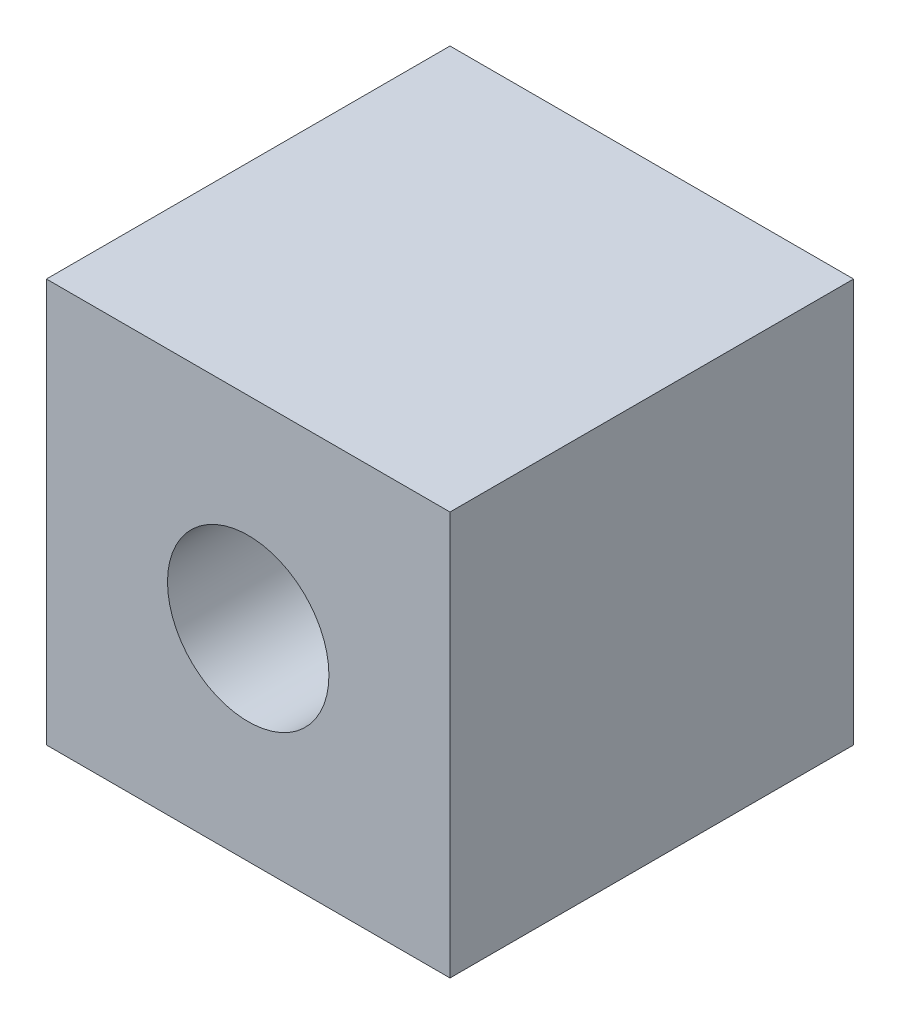
ISO-10303-21;
HEADER;
FILE_DESCRIPTION(('STEP AP214'),'2;1');
FILE_NAME('part.step','',(''),(''),'','','');
FILE_SCHEMA(('AUTOMOTIVE_DESIGN { 1 0 10303 214 1 1 1 1 }'));
ENDSEC;
DATA;
#1=APPLICATION_CONTEXT('core data for automotive mechanical design processes');
#2=APPLICATION_PROTOCOL_DEFINITION('international standard','automotive_design',2000,#1);
#3=PRODUCT_CONTEXT('',#1,'mechanical');
#4=PRODUCT('Part','Part','',(#3));
#5=PRODUCT_RELATED_PRODUCT_CATEGORY('part','',(#4));
#6=PRODUCT_DEFINITION_FORMATION('','',#4);
#7=PRODUCT_DEFINITION_CONTEXT('part definition',#1,'design');
#8=PRODUCT_DEFINITION('design','',#6,#7);
#9=PRODUCT_DEFINITION_SHAPE('','',#8);
#10=(LENGTH_UNIT() NAMED_UNIT(*) SI_UNIT(.MILLI.,.METRE.));
#11=(NAMED_UNIT(*) PLANE_ANGLE_UNIT() SI_UNIT($,.RADIAN.));
#12=(NAMED_UNIT(*) SI_UNIT($,.STERADIAN.) SOLID_ANGLE_UNIT());
#13=UNCERTAINTY_MEASURE_WITH_UNIT(LENGTH_MEASURE(1.E-05),#10,'distance_accuracy_value','');
#14=(GEOMETRIC_REPRESENTATION_CONTEXT(3) GLOBAL_UNCERTAINTY_ASSIGNED_CONTEXT((#13)) GLOBAL_UNIT_ASSIGNED_CONTEXT((#10,
#11,#12)) REPRESENTATION_CONTEXT('',''));
#15=CARTESIAN_POINT('',(0.,0.,0.));
#16=DIRECTION('',(0.,0.,1.));
#17=DIRECTION('',(1.,0.,0.));
#18=AXIS2_PLACEMENT_3D('',#15,#16,#17);
#19=CARTESIAN_POINT('',(25.,25.,50.));
#20=DIRECTION('',(-1.,0.,0.));
#21=DIRECTION('',(0.,0.,1.));
#22=AXIS2_PLACEMENT_3D('',#19,#20,#21);
#23=PLANE('',#22);
#24=DIRECTION('',(0.,1.,0.));
#25=VECTOR('',#24,1.);
#26=CARTESIAN_POINT('',(25.,25.,0.));
#27=LINE('',#26,#25);
#28=CARTESIAN_POINT('',(25.,-25.,0.));
#29=VERTEX_POINT('',#28);
#30=CARTESIAN_POINT('',(25.,25.,0.));
#31=VERTEX_POINT('',#30);
#32=EDGE_CURVE('E109',#29,#31,#27,.T.);
#33=ORIENTED_EDGE('',*,*,#32,.T.);
#34=DIRECTION('',(0.,0.,-1.));
#35=VECTOR('',#34,1.);
#36=CARTESIAN_POINT('',(25.,25.,50.));
#37=LINE('',#36,#35);
#38=CARTESIAN_POINT('',(25.,25.,50.));
#39=VERTEX_POINT('',#38);
#40=EDGE_CURVE('E11',#39,#31,#37,.T.);
#41=ORIENTED_EDGE('',*,*,#40,.F.);
#42=DIRECTION('',(0.,1.,0.));
#43=VECTOR('',#42,1.);
#44=CARTESIAN_POINT('',(25.,25.,50.));
#45=LINE('',#44,#43);
#46=CARTESIAN_POINT('',(25.,-25.,50.));
#47=VERTEX_POINT('',#46);
#48=EDGE_CURVE('E92',#47,#39,#45,.T.);
#49=ORIENTED_EDGE('',*,*,#48,.F.);
#50=DIRECTION('',(0.,0.,-1.));
#51=VECTOR('',#50,1.);
#52=CARTESIAN_POINT('',(25.,-25.,50.));
#53=LINE('',#52,#51);
#54=EDGE_CURVE('E105',#47,#29,#53,.T.);
#55=ORIENTED_EDGE('',*,*,#54,.T.);
#56=EDGE_LOOP('',(#33,#41,#49,#55));
#57=FACE_BOUND('',#56,.T.);
#58=ADVANCED_FACE('F40',(#57),#23,.F.);
#59=CARTESIAN_POINT('',(-25.,25.,50.));
#60=DIRECTION('',(0.,-1.,0.));
#61=DIRECTION('',(0.,0.,-1.));
#62=AXIS2_PLACEMENT_3D('',#59,#60,#61);
#63=PLANE('',#62);
#64=DIRECTION('',(-1.,0.,0.));
#65=VECTOR('',#64,1.);
#66=CARTESIAN_POINT('',(-25.,25.,0.));
#67=LINE('',#66,#65);
#68=CARTESIAN_POINT('',(-25.,25.,0.));
#69=VERTEX_POINT('',#68);
#70=EDGE_CURVE('E97',#31,#69,#67,.T.);
#71=ORIENTED_EDGE('',*,*,#70,.T.);
#72=DIRECTION('',(0.,0.,-1.));
#73=VECTOR('',#72,1.);
#74=CARTESIAN_POINT('',(-25.,25.,50.));
#75=LINE('',#74,#73);
#76=CARTESIAN_POINT('',(-25.,25.,50.));
#77=VERTEX_POINT('',#76);
#78=EDGE_CURVE('E49',#77,#69,#75,.T.);
#79=ORIENTED_EDGE('',*,*,#78,.F.);
#80=DIRECTION('',(-1.,0.,0.));
#81=VECTOR('',#80,1.);
#82=CARTESIAN_POINT('',(-25.,25.,50.));
#83=LINE('',#82,#81);
#84=EDGE_CURVE('E87',#39,#77,#83,.T.);
#85=ORIENTED_EDGE('',*,*,#84,.F.);
#86=ORIENTED_EDGE('',*,*,#40,.T.);
#87=EDGE_LOOP('',(#71,#79,#85,#86));
#88=FACE_BOUND('',#87,.T.);
#89=ADVANCED_FACE('F96',(#88),#63,.F.);
#90=CARTESIAN_POINT('',(-25.,25.,50.));
#91=DIRECTION('',(1.,0.,0.));
#92=DIRECTION('',(0.,1.,0.));
#93=AXIS2_PLACEMENT_3D('',#90,#91,#92);
#94=PLANE('',#93);
#95=DIRECTION('',(0.,-1.,0.));
#96=VECTOR('',#95,1.);
#97=CARTESIAN_POINT('',(-25.,25.,0.));
#98=LINE('',#97,#96);
#99=CARTESIAN_POINT('',(-25.,-25.,0.));
#100=VERTEX_POINT('',#99);
#101=EDGE_CURVE('E74',#69,#100,#98,.T.);
#102=ORIENTED_EDGE('',*,*,#101,.T.);
#103=DIRECTION('',(0.,0.,-1.));
#104=VECTOR('',#103,1.);
#105=CARTESIAN_POINT('',(-25.,-25.,50.));
#106=LINE('',#105,#104);
#107=CARTESIAN_POINT('',(-25.,-25.,50.));
#108=VERTEX_POINT('',#107);
#109=EDGE_CURVE('E99',#108,#100,#106,.T.);
#110=ORIENTED_EDGE('',*,*,#109,.F.);
#111=DIRECTION('',(0.,-1.,0.));
#112=VECTOR('',#111,1.);
#113=CARTESIAN_POINT('',(-25.,25.,50.));
#114=LINE('',#113,#112);
#115=EDGE_CURVE('E90',#77,#108,#114,.T.);
#116=ORIENTED_EDGE('',*,*,#115,.F.);
#117=ORIENTED_EDGE('',*,*,#78,.T.);
#118=EDGE_LOOP('',(#102,#110,#116,#117));
#119=FACE_BOUND('',#118,.T.);
#120=ADVANCED_FACE('F100',(#119),#94,.F.);
#121=CARTESIAN_POINT('',(-25.,-25.,50.));
#122=DIRECTION('',(0.,1.,0.));
#123=DIRECTION('',(0.,0.,1.));
#124=AXIS2_PLACEMENT_3D('',#121,#122,#123);
#125=PLANE('',#124);
#126=DIRECTION('',(1.,0.,0.));
#127=VECTOR('',#126,1.);
#128=CARTESIAN_POINT('',(-25.,-25.,0.));
#129=LINE('',#128,#127);
#130=EDGE_CURVE('E80',#100,#29,#129,.T.);
#131=ORIENTED_EDGE('',*,*,#130,.T.);
#132=ORIENTED_EDGE('',*,*,#54,.F.);
#133=DIRECTION('',(1.,0.,0.));
#134=VECTOR('',#133,1.);
#135=CARTESIAN_POINT('',(-25.,-25.,50.));
#136=LINE('',#135,#134);
#137=EDGE_CURVE('E57',#108,#47,#136,.T.);
#138=ORIENTED_EDGE('',*,*,#137,.F.);
#139=ORIENTED_EDGE('',*,*,#109,.T.);
#140=EDGE_LOOP('',(#131,#132,#138,#139));
#141=FACE_BOUND('',#140,.T.);
#142=ADVANCED_FACE('F122',(#141),#125,.F.);
#143=CARTESIAN_POINT('',(0.,0.,50.));
#144=DIRECTION('',(0.,0.,1.));
#145=DIRECTION('',(1.,0.,0.));
#146=AXIS2_PLACEMENT_3D('',#143,#144,#145);
#147=PLANE('',#146);
#148=CARTESIAN_POINT('',(0.,0.,50.));
#149=DIRECTION('',(0.,0.,1.));
#150=DIRECTION('',(1.,0.,0.));
#151=AXIS2_PLACEMENT_3D('',#148,#149,#150);
#152=CIRCLE('',#151,10.);
#153=CARTESIAN_POINT('',(10.,0.,50.));
#154=VERTEX_POINT('',#153);
#155=EDGE_CURVE('E129',#154,#154,#152,.T.);
#156=ORIENTED_EDGE('',*,*,#155,.F.);
#157=EDGE_LOOP('',(#156));
#158=FACE_BOUND('',#157,.T.);
#159=ORIENTED_EDGE('',*,*,#48,.T.);
#160=ORIENTED_EDGE('',*,*,#84,.T.);
#161=ORIENTED_EDGE('',*,*,#115,.T.);
#162=ORIENTED_EDGE('',*,*,#137,.T.);
#163=EDGE_LOOP('',(#159,#160,#161,#162));
#164=FACE_BOUND('',#163,.T.);
#165=ADVANCED_FACE('F88',(#158,#164),#147,.T.);
#166=CARTESIAN_POINT('',(0.,0.,0.));
#167=DIRECTION('',(0.,0.,1.));
#168=DIRECTION('',(1.,0.,0.));
#169=AXIS2_PLACEMENT_3D('',#166,#167,#168);
#170=PLANE('',#169);
#171=CARTESIAN_POINT('',(0.,0.,0.));
#172=DIRECTION('',(0.,0.,1.));
#173=DIRECTION('',(1.,0.,0.));
#174=AXIS2_PLACEMENT_3D('',#171,#172,#173);
#175=CIRCLE('',#174,10.);
#176=CARTESIAN_POINT('',(10.,0.,0.));
#177=VERTEX_POINT('',#176);
#178=EDGE_CURVE('E113',#177,#177,#175,.T.);
#179=ORIENTED_EDGE('',*,*,#178,.T.);
#180=EDGE_LOOP('',(#179));
#181=FACE_BOUND('',#180,.T.);
#182=ORIENTED_EDGE('',*,*,#32,.F.);
#183=ORIENTED_EDGE('',*,*,#130,.F.);
#184=ORIENTED_EDGE('',*,*,#101,.F.);
#185=ORIENTED_EDGE('',*,*,#70,.F.);
#186=EDGE_LOOP('',(#182,#183,#184,#185));
#187=FACE_BOUND('',#186,.T.);
#188=ADVANCED_FACE('F125',(#181,#187),#170,.F.);
#189=CARTESIAN_POINT('',(0.,0.,0.));
#190=DIRECTION('',(0.,0.,1.));
#191=DIRECTION('',(1.,0.,0.));
#192=AXIS2_PLACEMENT_3D('',#189,#190,#191);
#193=CYLINDRICAL_SURFACE('',#192,10.);
#194=ORIENTED_EDGE('',*,*,#178,.F.);
#195=EDGE_LOOP('',(#194));
#196=FACE_BOUND('',#195,.T.);
#197=ORIENTED_EDGE('',*,*,#155,.T.);
#198=EDGE_LOOP('',(#197));
#199=FACE_BOUND('',#198,.T.);
#200=ADVANCED_FACE('F138',(#196,#199),#193,.F.);
#201=CLOSED_SHELL('',(#58,#89,#120,#142,#165,#188,#200));
#202=MANIFOLD_SOLID_BREP('B2',#201);
#203=ADVANCED_BREP_SHAPE_REPRESENTATION('',(#18,#202),#14);
#204=SHAPE_DEFINITION_REPRESENTATION(#9,#203);
ENDSEC;
END-ISO-10303-21;
